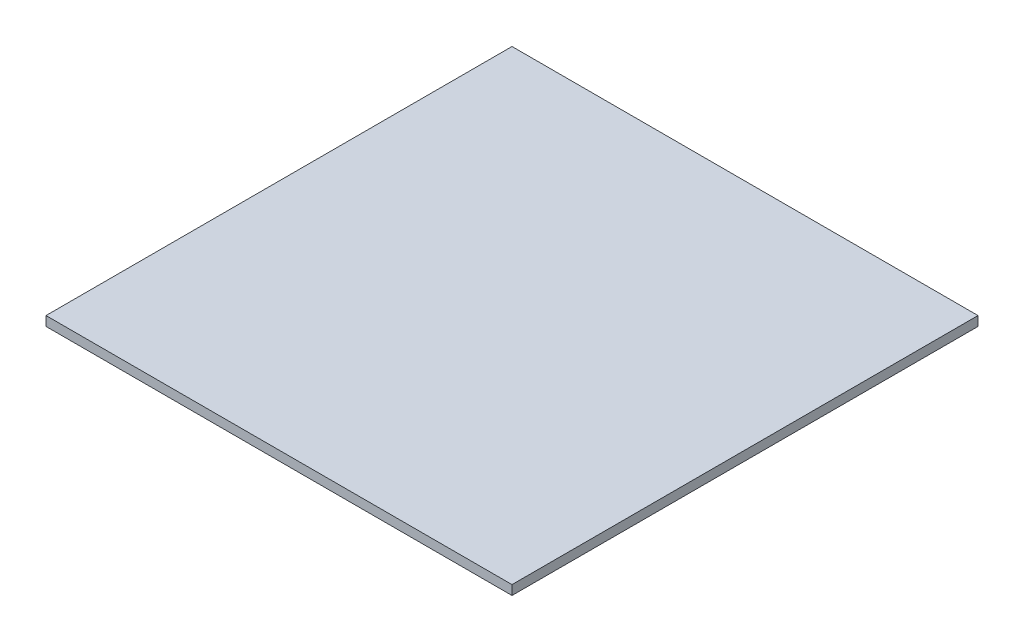
ISO-10303-21;
HEADER;
FILE_DESCRIPTION(('STEP AP214'),'2;1');
FILE_NAME('part.step','',(''),(''),'','','');
FILE_SCHEMA(('AUTOMOTIVE_DESIGN { 1 0 10303 214 1 1 1 1 }'));
ENDSEC;
DATA;
#1=APPLICATION_CONTEXT('core data for automotive mechanical design processes');
#2=APPLICATION_PROTOCOL_DEFINITION('international standard','automotive_design',2000,#1);
#3=PRODUCT_CONTEXT('',#1,'mechanical');
#4=PRODUCT('Part','Part','',(#3));
#5=PRODUCT_RELATED_PRODUCT_CATEGORY('part','',(#4));
#6=PRODUCT_DEFINITION_FORMATION('','',#4);
#7=PRODUCT_DEFINITION_CONTEXT('part definition',#1,'design');
#8=PRODUCT_DEFINITION('design','',#6,#7);
#9=PRODUCT_DEFINITION_SHAPE('','',#8);
#10=(LENGTH_UNIT() NAMED_UNIT(*) SI_UNIT(.MILLI.,.METRE.));
#11=(NAMED_UNIT(*) PLANE_ANGLE_UNIT() SI_UNIT($,.RADIAN.));
#12=(NAMED_UNIT(*) SI_UNIT($,.STERADIAN.) SOLID_ANGLE_UNIT());
#13=UNCERTAINTY_MEASURE_WITH_UNIT(LENGTH_MEASURE(1.E-05),#10,'distance_accuracy_value','');
#14=(GEOMETRIC_REPRESENTATION_CONTEXT(3) GLOBAL_UNCERTAINTY_ASSIGNED_CONTEXT((#13)) GLOBAL_UNIT_ASSIGNED_CONTEXT((#10,
#11,#12)) REPRESENTATION_CONTEXT('',''));
#15=CARTESIAN_POINT('',(0.,0.,0.));
#16=DIRECTION('',(0.,0.,1.));
#17=DIRECTION('',(1.,0.,0.));
#18=AXIS2_PLACEMENT_3D('',#15,#16,#17);
#19=CARTESIAN_POINT('',(5.,0.203,-5.));
#20=DIRECTION('',(-1.,0.,0.));
#21=DIRECTION('',(0.,0.,1.));
#22=AXIS2_PLACEMENT_3D('',#19,#20,#21);
#23=PLANE('',#22);
#24=DIRECTION('',(0.,0.,-1.));
#25=VECTOR('',#24,1.);
#26=CARTESIAN_POINT('',(5.,0.,-5.));
#27=LINE('',#26,#25);
#28=CARTESIAN_POINT('',(5.,0.,5.));
#29=VERTEX_POINT('',#28);
#30=CARTESIAN_POINT('',(5.,0.,-5.));
#31=VERTEX_POINT('',#30);
#32=EDGE_CURVE('E104',#29,#31,#27,.T.);
#33=ORIENTED_EDGE('',*,*,#32,.T.);
#34=DIRECTION('',(0.,-1.,0.));
#35=VECTOR('',#34,1.);
#36=CARTESIAN_POINT('',(5.,0.203,-5.));
#37=LINE('',#36,#35);
#38=CARTESIAN_POINT('',(5.,0.203,-5.));
#39=VERTEX_POINT('',#38);
#40=EDGE_CURVE('E11',#39,#31,#37,.T.);
#41=ORIENTED_EDGE('',*,*,#40,.F.);
#42=DIRECTION('',(0.,0.,-1.));
#43=VECTOR('',#42,1.);
#44=CARTESIAN_POINT('',(5.,0.203,-5.));
#45=LINE('',#44,#43);
#46=CARTESIAN_POINT('',(5.,0.203,5.));
#47=VERTEX_POINT('',#46);
#48=EDGE_CURVE('E92',#47,#39,#45,.T.);
#49=ORIENTED_EDGE('',*,*,#48,.F.);
#50=DIRECTION('',(0.,-1.,0.));
#51=VECTOR('',#50,1.);
#52=CARTESIAN_POINT('',(5.,0.203,5.));
#53=LINE('',#52,#51);
#54=EDGE_CURVE('E100',#47,#29,#53,.T.);
#55=ORIENTED_EDGE('',*,*,#54,.T.);
#56=EDGE_LOOP('',(#33,#41,#49,#55));
#57=FACE_BOUND('',#56,.T.);
#58=ADVANCED_FACE('F41',(#57),#23,.F.);
#59=CARTESIAN_POINT('',(-5.,0.203,-5.));
#60=DIRECTION('',(0.,0.,1.));
#61=DIRECTION('',(1.,0.,0.));
#62=AXIS2_PLACEMENT_3D('',#59,#60,#61);
#63=PLANE('',#62);
#64=DIRECTION('',(-1.,0.,0.));
#65=VECTOR('',#64,1.);
#66=CARTESIAN_POINT('',(-5.,0.,-5.));
#67=LINE('',#66,#65);
#68=CARTESIAN_POINT('',(-5.,0.,-5.));
#69=VERTEX_POINT('',#68);
#70=EDGE_CURVE('E96',#31,#69,#67,.T.);
#71=ORIENTED_EDGE('',*,*,#70,.T.);
#72=DIRECTION('',(0.,-1.,0.));
#73=VECTOR('',#72,1.);
#74=CARTESIAN_POINT('',(-5.,0.203,-5.));
#75=LINE('',#74,#73);
#76=CARTESIAN_POINT('',(-5.,0.203,-5.));
#77=VERTEX_POINT('',#76);
#78=EDGE_CURVE('E49',#77,#69,#75,.T.);
#79=ORIENTED_EDGE('',*,*,#78,.F.);
#80=DIRECTION('',(-1.,0.,0.));
#81=VECTOR('',#80,1.);
#82=CARTESIAN_POINT('',(-5.,0.203,-5.));
#83=LINE('',#82,#81);
#84=EDGE_CURVE('E87',#39,#77,#83,.T.);
#85=ORIENTED_EDGE('',*,*,#84,.F.);
#86=ORIENTED_EDGE('',*,*,#40,.T.);
#87=EDGE_LOOP('',(#71,#79,#85,#86));
#88=FACE_BOUND('',#87,.T.);
#89=ADVANCED_FACE('F95',(#88),#63,.F.);
#90=CARTESIAN_POINT('',(-5.,0.203,-5.));
#91=DIRECTION('',(1.,0.,0.));
#92=DIRECTION('',(0.,0.,-1.));
#93=AXIS2_PLACEMENT_3D('',#90,#91,#92);
#94=PLANE('',#93);
#95=DIRECTION('',(0.,0.,1.));
#96=VECTOR('',#95,1.);
#97=CARTESIAN_POINT('',(-5.,0.,-5.));
#98=LINE('',#97,#96);
#99=CARTESIAN_POINT('',(-5.,0.,5.));
#100=VERTEX_POINT('',#99);
#101=EDGE_CURVE('E74',#69,#100,#98,.T.);
#102=ORIENTED_EDGE('',*,*,#101,.T.);
#103=DIRECTION('',(0.,-1.,0.));
#104=VECTOR('',#103,1.);
#105=CARTESIAN_POINT('',(-5.,0.203,5.));
#106=LINE('',#105,#104);
#107=CARTESIAN_POINT('',(-5.,0.203,5.));
#108=VERTEX_POINT('',#107);
#109=EDGE_CURVE('E97',#108,#100,#106,.T.);
#110=ORIENTED_EDGE('',*,*,#109,.F.);
#111=DIRECTION('',(0.,0.,1.));
#112=VECTOR('',#111,1.);
#113=CARTESIAN_POINT('',(-5.,0.203,-5.));
#114=LINE('',#113,#112);
#115=EDGE_CURVE('E90',#77,#108,#114,.T.);
#116=ORIENTED_EDGE('',*,*,#115,.F.);
#117=ORIENTED_EDGE('',*,*,#78,.T.);
#118=EDGE_LOOP('',(#102,#110,#116,#117));
#119=FACE_BOUND('',#118,.T.);
#120=ADVANCED_FACE('F98',(#119),#94,.F.);
#121=CARTESIAN_POINT('',(-5.,0.203,5.));
#122=DIRECTION('',(0.,0.,-1.));
#123=DIRECTION('',(-1.,0.,0.));
#124=AXIS2_PLACEMENT_3D('',#121,#122,#123);
#125=PLANE('',#124);
#126=DIRECTION('',(1.,0.,0.));
#127=VECTOR('',#126,1.);
#128=CARTESIAN_POINT('',(-5.,0.,5.));
#129=LINE('',#128,#127);
#130=EDGE_CURVE('E80',#100,#29,#129,.T.);
#131=ORIENTED_EDGE('',*,*,#130,.T.);
#132=ORIENTED_EDGE('',*,*,#54,.F.);
#133=DIRECTION('',(1.,0.,0.));
#134=VECTOR('',#133,1.);
#135=CARTESIAN_POINT('',(-5.,0.203,5.));
#136=LINE('',#135,#134);
#137=EDGE_CURVE('E57',#108,#47,#136,.T.);
#138=ORIENTED_EDGE('',*,*,#137,.F.);
#139=ORIENTED_EDGE('',*,*,#109,.T.);
#140=EDGE_LOOP('',(#131,#132,#138,#139));
#141=FACE_BOUND('',#140,.T.);
#142=ADVANCED_FACE('F111',(#141),#125,.F.);
#143=CARTESIAN_POINT('',(0.,0.203,0.));
#144=DIRECTION('',(0.,1.,0.));
#145=DIRECTION('',(0.,0.,1.));
#146=AXIS2_PLACEMENT_3D('',#143,#144,#145);
#147=PLANE('',#146);
#148=ORIENTED_EDGE('',*,*,#48,.T.);
#149=ORIENTED_EDGE('',*,*,#84,.T.);
#150=ORIENTED_EDGE('',*,*,#115,.T.);
#151=ORIENTED_EDGE('',*,*,#137,.T.);
#152=EDGE_LOOP('',(#148,#149,#150,#151));
#153=FACE_BOUND('',#152,.T.);
#154=ADVANCED_FACE('F88',(#153),#147,.T.);
#155=CARTESIAN_POINT('',(0.,0.,0.));
#156=DIRECTION('',(0.,1.,0.));
#157=DIRECTION('',(0.,0.,1.));
#158=AXIS2_PLACEMENT_3D('',#155,#156,#157);
#159=PLANE('',#158);
#160=ORIENTED_EDGE('',*,*,#32,.F.);
#161=ORIENTED_EDGE('',*,*,#130,.F.);
#162=ORIENTED_EDGE('',*,*,#101,.F.);
#163=ORIENTED_EDGE('',*,*,#70,.F.);
#164=EDGE_LOOP('',(#160,#161,#162,#163));
#165=FACE_BOUND('',#164,.T.);
#166=ADVANCED_FACE('F114',(#165),#159,.F.);
#167=CLOSED_SHELL('',(#58,#89,#120,#142,#154,#166));
#168=MANIFOLD_SOLID_BREP('B2',#167);
#169=ADVANCED_BREP_SHAPE_REPRESENTATION('',(#18,#168),#14);
#170=SHAPE_DEFINITION_REPRESENTATION(#9,#169);
ENDSEC;
END-ISO-10303-21;
